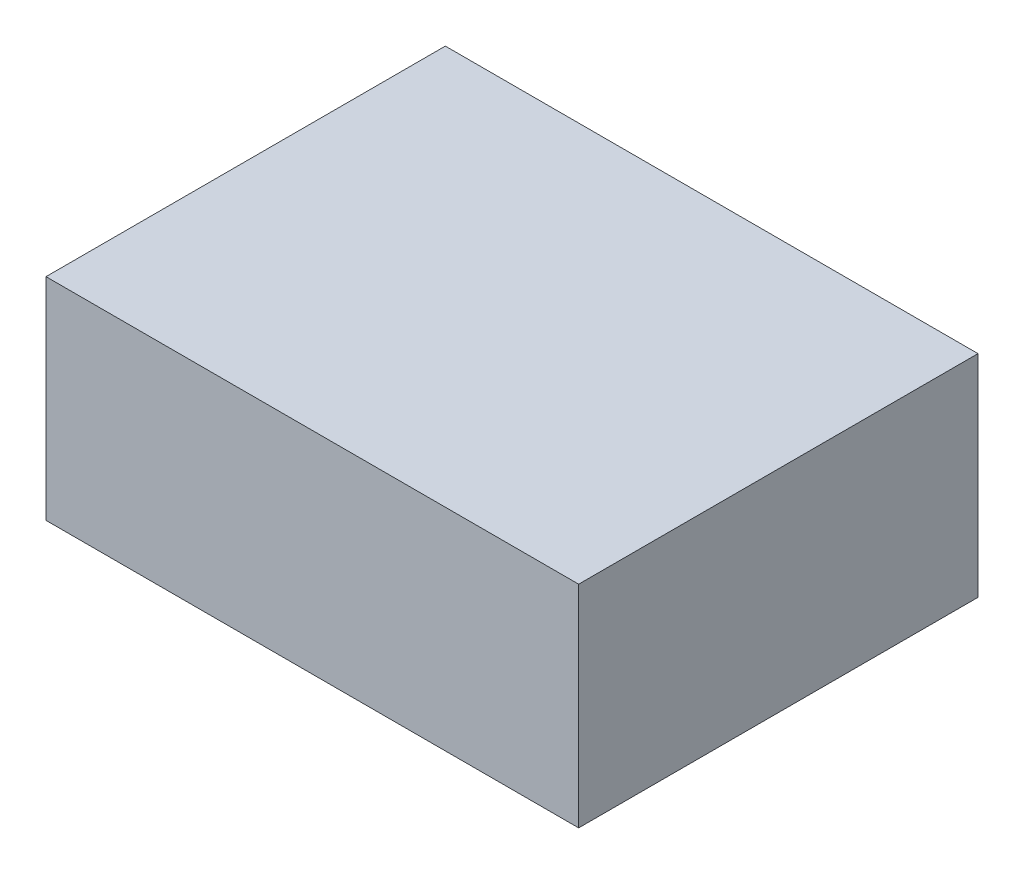
ISO-10303-21;
HEADER;
FILE_DESCRIPTION(('STEP AP214'),'2;1');
FILE_NAME('part.step','',(''),(''),'','','');
FILE_SCHEMA(('AUTOMOTIVE_DESIGN { 1 0 10303 214 1 1 1 1 }'));
ENDSEC;
DATA;
#1=APPLICATION_CONTEXT('core data for automotive mechanical design processes');
#2=APPLICATION_PROTOCOL_DEFINITION('international standard','automotive_design',2000,#1);
#3=PRODUCT_CONTEXT('',#1,'mechanical');
#4=PRODUCT('Part','Part','',(#3));
#5=PRODUCT_RELATED_PRODUCT_CATEGORY('part','',(#4));
#6=PRODUCT_DEFINITION_FORMATION('','',#4);
#7=PRODUCT_DEFINITION_CONTEXT('part definition',#1,'design');
#8=PRODUCT_DEFINITION('design','',#6,#7);
#9=PRODUCT_DEFINITION_SHAPE('','',#8);
#10=(LENGTH_UNIT() NAMED_UNIT(*) SI_UNIT(.MILLI.,.METRE.));
#11=(NAMED_UNIT(*) PLANE_ANGLE_UNIT() SI_UNIT($,.RADIAN.));
#12=(NAMED_UNIT(*) SI_UNIT($,.STERADIAN.) SOLID_ANGLE_UNIT());
#13=UNCERTAINTY_MEASURE_WITH_UNIT(LENGTH_MEASURE(1.E-05),#10,'distance_accuracy_value','');
#14=(GEOMETRIC_REPRESENTATION_CONTEXT(3) GLOBAL_UNCERTAINTY_ASSIGNED_CONTEXT((#13)) GLOBAL_UNIT_ASSIGNED_CONTEXT((#10,
#11,#12)) REPRESENTATION_CONTEXT('',''));
#15=CARTESIAN_POINT('',(0.,0.,0.));
#16=DIRECTION('',(0.,0.,1.));
#17=DIRECTION('',(1.,0.,0.));
#18=AXIS2_PLACEMENT_3D('',#15,#16,#17);
#19=CARTESIAN_POINT('',(4.315,3.42,-3.235));
#20=DIRECTION('',(-1.,0.,0.));
#21=DIRECTION('',(0.,0.,1.));
#22=AXIS2_PLACEMENT_3D('',#19,#20,#21);
#23=PLANE('',#22);
#24=DIRECTION('',(0.,0.,-1.));
#25=VECTOR('',#24,1.);
#26=CARTESIAN_POINT('',(4.315,0.,-3.235));
#27=LINE('',#26,#25);
#28=CARTESIAN_POINT('',(4.315,0.,3.235));
#29=VERTEX_POINT('',#28);
#30=CARTESIAN_POINT('',(4.315,0.,-3.235));
#31=VERTEX_POINT('',#30);
#32=EDGE_CURVE('E93',#29,#31,#27,.T.);
#33=ORIENTED_EDGE('',*,*,#32,.T.);
#34=DIRECTION('',(0.,-1.,0.));
#35=VECTOR('',#34,1.);
#36=CARTESIAN_POINT('',(4.315,3.42,-3.235));
#37=LINE('',#36,#35);
#38=CARTESIAN_POINT('',(4.315,3.42,-3.235));
#39=VERTEX_POINT('',#38);
#40=EDGE_CURVE('E11',#39,#31,#37,.T.);
#41=ORIENTED_EDGE('',*,*,#40,.F.);
#42=DIRECTION('',(0.,0.,-1.));
#43=VECTOR('',#42,1.);
#44=CARTESIAN_POINT('',(4.315,3.42,-3.235));
#45=LINE('',#44,#43);
#46=CARTESIAN_POINT('',(4.315,3.42,3.235));
#47=VERTEX_POINT('',#46);
#48=EDGE_CURVE('E81',#47,#39,#45,.T.);
#49=ORIENTED_EDGE('',*,*,#48,.F.);
#50=DIRECTION('',(0.,-1.,0.));
#51=VECTOR('',#50,1.);
#52=CARTESIAN_POINT('',(4.315,3.42,3.235));
#53=LINE('',#52,#51);
#54=EDGE_CURVE('E89',#47,#29,#53,.T.);
#55=ORIENTED_EDGE('',*,*,#54,.T.);
#56=EDGE_LOOP('',(#33,#41,#49,#55));
#57=FACE_BOUND('',#56,.T.);
#58=ADVANCED_FACE('F30',(#57),#23,.F.);
#59=CARTESIAN_POINT('',(-4.315,3.42,-3.235));
#60=DIRECTION('',(0.,0.,1.));
#61=DIRECTION('',(1.,0.,0.));
#62=AXIS2_PLACEMENT_3D('',#59,#60,#61);
#63=PLANE('',#62);
#64=DIRECTION('',(-1.,0.,0.));
#65=VECTOR('',#64,1.);
#66=CARTESIAN_POINT('',(-4.315,0.,-3.235));
#67=LINE('',#66,#65);
#68=CARTESIAN_POINT('',(-4.315,0.,-3.235));
#69=VERTEX_POINT('',#68);
#70=EDGE_CURVE('E85',#31,#69,#67,.T.);
#71=ORIENTED_EDGE('',*,*,#70,.T.);
#72=DIRECTION('',(0.,-1.,0.));
#73=VECTOR('',#72,1.);
#74=CARTESIAN_POINT('',(-4.315,3.42,-3.235));
#75=LINE('',#74,#73);
#76=CARTESIAN_POINT('',(-4.315,3.42,-3.235));
#77=VERTEX_POINT('',#76);
#78=EDGE_CURVE('E38',#77,#69,#75,.T.);
#79=ORIENTED_EDGE('',*,*,#78,.F.);
#80=DIRECTION('',(-1.,0.,0.));
#81=VECTOR('',#80,1.);
#82=CARTESIAN_POINT('',(-4.315,3.42,-3.235));
#83=LINE('',#82,#81);
#84=EDGE_CURVE('E76',#39,#77,#83,.T.);
#85=ORIENTED_EDGE('',*,*,#84,.F.);
#86=ORIENTED_EDGE('',*,*,#40,.T.);
#87=EDGE_LOOP('',(#71,#79,#85,#86));
#88=FACE_BOUND('',#87,.T.);
#89=ADVANCED_FACE('F84',(#88),#63,.F.);
#90=CARTESIAN_POINT('',(-4.315,3.42,-3.235));
#91=DIRECTION('',(1.,0.,0.));
#92=DIRECTION('',(0.,0.,-1.));
#93=AXIS2_PLACEMENT_3D('',#90,#91,#92);
#94=PLANE('',#93);
#95=DIRECTION('',(0.,0.,1.));
#96=VECTOR('',#95,1.);
#97=CARTESIAN_POINT('',(-4.315,0.,-3.235));
#98=LINE('',#97,#96);
#99=CARTESIAN_POINT('',(-4.315,0.,3.235));
#100=VERTEX_POINT('',#99);
#101=EDGE_CURVE('E63',#69,#100,#98,.T.);
#102=ORIENTED_EDGE('',*,*,#101,.T.);
#103=DIRECTION('',(0.,-1.,0.));
#104=VECTOR('',#103,1.);
#105=CARTESIAN_POINT('',(-4.315,3.42,3.235));
#106=LINE('',#105,#104);
#107=CARTESIAN_POINT('',(-4.315,3.42,3.235));
#108=VERTEX_POINT('',#107);
#109=EDGE_CURVE('E86',#108,#100,#106,.T.);
#110=ORIENTED_EDGE('',*,*,#109,.F.);
#111=DIRECTION('',(0.,0.,1.));
#112=VECTOR('',#111,1.);
#113=CARTESIAN_POINT('',(-4.315,3.42,-3.235));
#114=LINE('',#113,#112);
#115=EDGE_CURVE('E79',#77,#108,#114,.T.);
#116=ORIENTED_EDGE('',*,*,#115,.F.);
#117=ORIENTED_EDGE('',*,*,#78,.T.);
#118=EDGE_LOOP('',(#102,#110,#116,#117));
#119=FACE_BOUND('',#118,.T.);
#120=ADVANCED_FACE('F87',(#119),#94,.F.);
#121=CARTESIAN_POINT('',(-4.315,3.42,3.235));
#122=DIRECTION('',(0.,0.,-1.));
#123=DIRECTION('',(-1.,0.,0.));
#124=AXIS2_PLACEMENT_3D('',#121,#122,#123);
#125=PLANE('',#124);
#126=DIRECTION('',(1.,0.,0.));
#127=VECTOR('',#126,1.);
#128=CARTESIAN_POINT('',(-4.315,0.,3.235));
#129=LINE('',#128,#127);
#130=EDGE_CURVE('E69',#100,#29,#129,.T.);
#131=ORIENTED_EDGE('',*,*,#130,.T.);
#132=ORIENTED_EDGE('',*,*,#54,.F.);
#133=DIRECTION('',(1.,0.,0.));
#134=VECTOR('',#133,1.);
#135=CARTESIAN_POINT('',(-4.315,3.42,3.235));
#136=LINE('',#135,#134);
#137=EDGE_CURVE('E46',#108,#47,#136,.T.);
#138=ORIENTED_EDGE('',*,*,#137,.F.);
#139=ORIENTED_EDGE('',*,*,#109,.T.);
#140=EDGE_LOOP('',(#131,#132,#138,#139));
#141=FACE_BOUND('',#140,.T.);
#142=ADVANCED_FACE('F100',(#141),#125,.F.);
#143=CARTESIAN_POINT('',(4.315,3.42,3.235));
#144=DIRECTION('',(0.,1.,0.));
#145=DIRECTION('',(0.,0.,1.));
#146=AXIS2_PLACEMENT_3D('',#143,#144,#145);
#147=PLANE('',#146);
#148=ORIENTED_EDGE('',*,*,#48,.T.);
#149=ORIENTED_EDGE('',*,*,#84,.T.);
#150=ORIENTED_EDGE('',*,*,#115,.T.);
#151=ORIENTED_EDGE('',*,*,#137,.T.);
#152=EDGE_LOOP('',(#148,#149,#150,#151));
#153=FACE_BOUND('',#152,.T.);
#154=ADVANCED_FACE('F77',(#153),#147,.T.);
#155=CARTESIAN_POINT('',(4.315,0.,3.235));
#156=DIRECTION('',(0.,1.,0.));
#157=DIRECTION('',(0.,0.,1.));
#158=AXIS2_PLACEMENT_3D('',#155,#156,#157);
#159=PLANE('',#158);
#160=ORIENTED_EDGE('',*,*,#32,.F.);
#161=ORIENTED_EDGE('',*,*,#130,.F.);
#162=ORIENTED_EDGE('',*,*,#101,.F.);
#163=ORIENTED_EDGE('',*,*,#70,.F.);
#164=EDGE_LOOP('',(#160,#161,#162,#163));
#165=FACE_BOUND('',#164,.T.);
#166=ADVANCED_FACE('F103',(#165),#159,.F.);
#167=CLOSED_SHELL('',(#58,#89,#120,#142,#154,#166));
#168=MANIFOLD_SOLID_BREP('B2',#167);
#169=ADVANCED_BREP_SHAPE_REPRESENTATION('',(#18,#168),#14);
#170=SHAPE_DEFINITION_REPRESENTATION(#9,#169);
ENDSEC;
END-ISO-10303-21;
